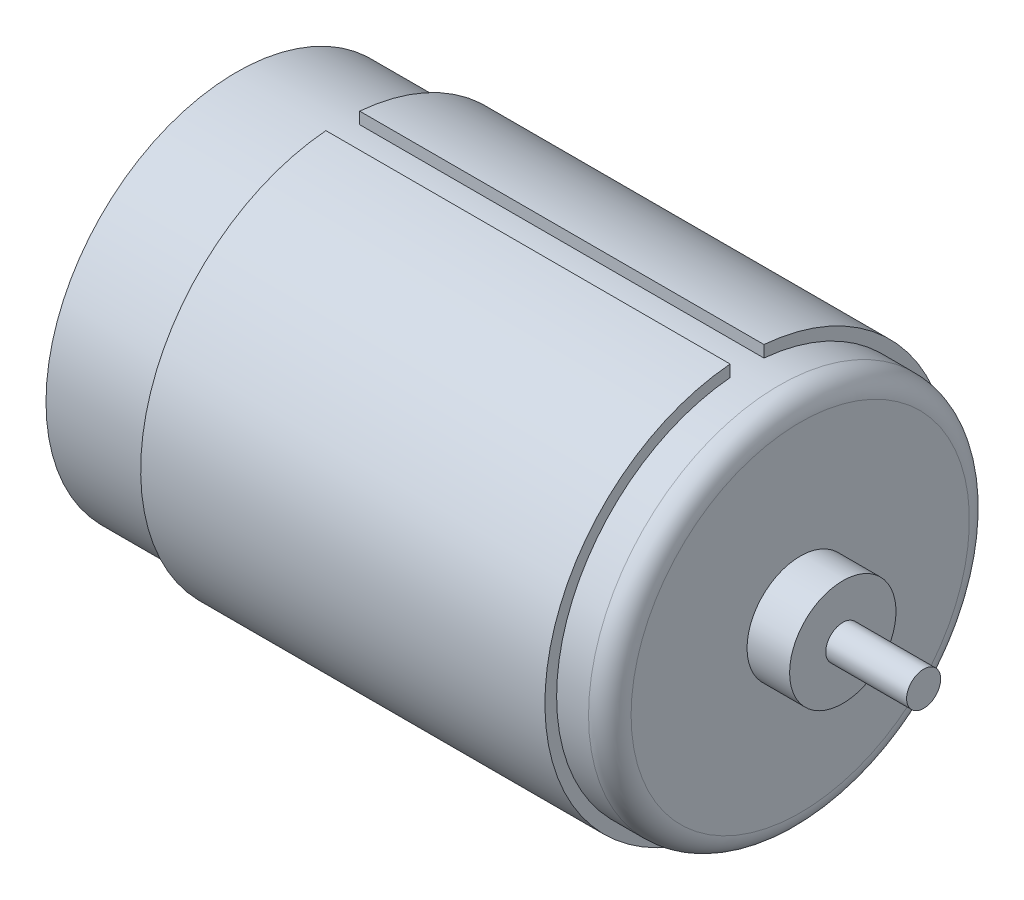
ISO-10303-21;
HEADER;
FILE_DESCRIPTION(('STEP AP214'),'2;1');
FILE_NAME('part.step','',(''),(''),'','','');
FILE_SCHEMA(('AUTOMOTIVE_DESIGN { 1 0 10303 214 1 1 1 1 }'));
ENDSEC;
DATA;
#1=APPLICATION_CONTEXT('core data for automotive mechanical design processes');
#2=APPLICATION_PROTOCOL_DEFINITION('international standard','automotive_design',2000,#1);
#3=PRODUCT_CONTEXT('',#1,'mechanical');
#4=PRODUCT('Part','Part','',(#3));
#5=PRODUCT_RELATED_PRODUCT_CATEGORY('part','',(#4));
#6=PRODUCT_DEFINITION_FORMATION('','',#4);
#7=PRODUCT_DEFINITION_CONTEXT('part definition',#1,'design');
#8=PRODUCT_DEFINITION('design','',#6,#7);
#9=PRODUCT_DEFINITION_SHAPE('','',#8);
#10=(LENGTH_UNIT() NAMED_UNIT(*) SI_UNIT(.MILLI.,.METRE.));
#11=(NAMED_UNIT(*) PLANE_ANGLE_UNIT() SI_UNIT($,.RADIAN.));
#12=(NAMED_UNIT(*) SI_UNIT($,.STERADIAN.) SOLID_ANGLE_UNIT());
#13=UNCERTAINTY_MEASURE_WITH_UNIT(LENGTH_MEASURE(1.E-05),#10,'distance_accuracy_value','');
#14=(GEOMETRIC_REPRESENTATION_CONTEXT(3) GLOBAL_UNCERTAINTY_ASSIGNED_CONTEXT((#13)) GLOBAL_UNIT_ASSIGNED_CONTEXT((#10,
#11,#12)) REPRESENTATION_CONTEXT('',''));
#15=CARTESIAN_POINT('',(0.,0.,0.));
#16=DIRECTION('',(0.,0.,1.));
#17=DIRECTION('',(1.,0.,0.));
#18=AXIS2_PLACEMENT_3D('',#15,#16,#17);
#19=CARTESIAN_POINT('',(0.,0.,0.));
#20=DIRECTION('',(1.,0.,0.));
#21=DIRECTION('',(0.,0.,-1.));
#22=AXIS2_PLACEMENT_3D('',#19,#20,#21);
#23=PLANE('',#22);
#24=CARTESIAN_POINT('',(0.,0.,0.));
#25=DIRECTION('',(-1.,0.,0.));
#26=DIRECTION('',(0.,0.,1.));
#27=AXIS2_PLACEMENT_3D('',#24,#25,#26);
#28=CIRCLE('',#27,17.9);
#29=CARTESIAN_POINT('',(0.,0.,17.9));
#30=VERTEX_POINT('',#29);
#31=EDGE_CURVE('E11',#30,#30,#28,.T.);
#32=ORIENTED_EDGE('',*,*,#31,.T.);
#33=EDGE_LOOP('',(#32));
#34=FACE_BOUND('',#33,.T.);
#35=ADVANCED_FACE('F33',(#34),#23,.F.);
#36=CARTESIAN_POINT('',(10.,17.9,0.));
#37=DIRECTION('',(1.,0.,0.));
#38=DIRECTION('',(0.,0.,-1.));
#39=AXIS2_PLACEMENT_3D('',#36,#37,#38);
#40=PLANE('',#39);
#41=CARTESIAN_POINT('',(10.,0.,0.));
#42=DIRECTION('',(-1.,0.,0.));
#43=DIRECTION('',(0.,0.,1.));
#44=AXIS2_PLACEMENT_3D('',#41,#42,#43);
#45=CIRCLE('',#44,17.9);
#46=CARTESIAN_POINT('',(10.,17.829465604723,-1.5875));
#47=VERTEX_POINT('',#46);
#48=CARTESIAN_POINT('',(10.,17.829465604723,1.5875));
#49=VERTEX_POINT('',#48);
#50=EDGE_CURVE('E41',#47,#49,#45,.T.);
#51=ORIENTED_EDGE('',*,*,#50,.F.);
#52=DIRECTION('',(0.,-1.,0.));
#53=VECTOR('',#52,1.);
#54=CARTESIAN_POINT('',(10.,18.9335639473925,-1.5875));
#55=LINE('',#54,#53);
#56=CARTESIAN_POINT('',(10.,18.9335639473925,-1.5875));
#57=VERTEX_POINT('',#56);
#58=EDGE_CURVE('E81',#57,#47,#55,.T.);
#59=ORIENTED_EDGE('',*,*,#58,.F.);
#60=CARTESIAN_POINT('',(10.,0.,0.));
#61=DIRECTION('',(-1.,0.,0.));
#62=DIRECTION('',(0.,0.,1.));
#63=AXIS2_PLACEMENT_3D('',#60,#61,#62);
#64=CIRCLE('',#63,19.);
#65=CARTESIAN_POINT('',(10.,18.9335639473925,1.5875));
#66=VERTEX_POINT('',#65);
#67=EDGE_CURVE('E89',#57,#66,#64,.T.);
#68=ORIENTED_EDGE('',*,*,#67,.T.);
#69=DIRECTION('',(0.,1.,0.));
#70=VECTOR('',#69,1.);
#71=CARTESIAN_POINT('',(10.,18.9335639473925,1.5875));
#72=LINE('',#71,#70);
#73=EDGE_CURVE('E74',#49,#66,#72,.T.);
#74=ORIENTED_EDGE('',*,*,#73,.F.);
#75=EDGE_LOOP('',(#51,#59,#68,#74));
#76=FACE_BOUND('',#75,.T.);
#77=ADVANCED_FACE('F86',(#76),#40,.F.);
#78=CARTESIAN_POINT('',(0.,0.,0.));
#79=DIRECTION('',(-1.,0.,0.));
#80=DIRECTION('',(0.,0.,1.));
#81=AXIS2_PLACEMENT_3D('',#78,#79,#80);
#82=CYLINDRICAL_SURFACE('',#81,19.);
#83=ORIENTED_EDGE('',*,*,#67,.F.);
#84=DIRECTION('',(-1.,0.,0.));
#85=VECTOR('',#84,1.);
#86=CARTESIAN_POINT('',(64.601,18.9335639473925,-1.5875));
#87=LINE('',#86,#85);
#88=CARTESIAN_POINT('',(48.,18.9335639473925,-1.5875));
#89=VERTEX_POINT('',#88);
#90=EDGE_CURVE('E127',#89,#57,#87,.T.);
#91=ORIENTED_EDGE('',*,*,#90,.F.);
#92=CARTESIAN_POINT('',(48.,0.,0.));
#93=DIRECTION('',(-1.,0.,0.));
#94=DIRECTION('',(0.,0.,1.));
#95=AXIS2_PLACEMENT_3D('',#92,#93,#94);
#96=CIRCLE('',#95,19.);
#97=CARTESIAN_POINT('',(48.,18.9335639473925,1.5875));
#98=VERTEX_POINT('',#97);
#99=EDGE_CURVE('E94',#89,#98,#96,.T.);
#100=ORIENTED_EDGE('',*,*,#99,.T.);
#101=DIRECTION('',(-1.,0.,0.));
#102=VECTOR('',#101,1.);
#103=CARTESIAN_POINT('',(64.601,18.9335639473925,1.5875));
#104=LINE('',#103,#102);
#105=EDGE_CURVE('E80',#98,#66,#104,.T.);
#106=ORIENTED_EDGE('',*,*,#105,.T.);
#107=EDGE_LOOP('',(#83,#91,#100,#106));
#108=FACE_BOUND('',#107,.T.);
#109=ADVANCED_FACE('F136',(#108),#82,.T.);
#110=CARTESIAN_POINT('',(48.,19.,0.));
#111=DIRECTION('',(-1.,0.,0.));
#112=DIRECTION('',(0.,0.,1.));
#113=AXIS2_PLACEMENT_3D('',#110,#111,#112);
#114=PLANE('',#113);
#115=ORIENTED_EDGE('',*,*,#99,.F.);
#116=DIRECTION('',(0.,1.,0.));
#117=VECTOR('',#116,1.);
#118=CARTESIAN_POINT('',(48.,18.9335639473925,-1.5875));
#119=LINE('',#118,#117);
#120=CARTESIAN_POINT('',(48.,17.829465604723,-1.5875));
#121=VERTEX_POINT('',#120);
#122=EDGE_CURVE('E90',#121,#89,#119,.T.);
#123=ORIENTED_EDGE('',*,*,#122,.F.);
#124=CARTESIAN_POINT('',(48.,0.,0.));
#125=DIRECTION('',(-1.,0.,0.));
#126=DIRECTION('',(0.,0.,1.));
#127=AXIS2_PLACEMENT_3D('',#124,#125,#126);
#128=CIRCLE('',#127,17.9);
#129=CARTESIAN_POINT('',(48.,17.829465604723,1.5875));
#130=VERTEX_POINT('',#129);
#131=EDGE_CURVE('E99',#121,#130,#128,.T.);
#132=ORIENTED_EDGE('',*,*,#131,.T.);
#133=DIRECTION('',(0.,-1.,0.));
#134=VECTOR('',#133,1.);
#135=CARTESIAN_POINT('',(48.,18.9335639473925,1.5875));
#136=LINE('',#135,#134);
#137=EDGE_CURVE('E48',#98,#130,#136,.T.);
#138=ORIENTED_EDGE('',*,*,#137,.F.);
#139=EDGE_LOOP('',(#115,#123,#132,#138));
#140=FACE_BOUND('',#139,.T.);
#141=ADVANCED_FACE('F137',(#140),#114,.F.);
#142=CARTESIAN_POINT('',(0.,0.,0.));
#143=DIRECTION('',(-1.,0.,0.));
#144=DIRECTION('',(0.,0.,1.));
#145=AXIS2_PLACEMENT_3D('',#142,#143,#144);
#146=CYLINDRICAL_SURFACE('',#145,17.9);
#147=ORIENTED_EDGE('',*,*,#131,.F.);
#148=DIRECTION('',(-1.,0.,0.));
#149=VECTOR('',#148,1.);
#150=CARTESIAN_POINT('',(64.601,17.829465604723,-1.5875));
#151=LINE('',#150,#149);
#152=EDGE_CURVE('E56',#121,#47,#151,.T.);
#153=ORIENTED_EDGE('',*,*,#152,.T.);
#154=ORIENTED_EDGE('',*,*,#50,.T.);
#155=DIRECTION('',(-1.,0.,0.));
#156=VECTOR('',#155,1.);
#157=CARTESIAN_POINT('',(64.601,17.829465604723,1.5875));
#158=LINE('',#157,#156);
#159=EDGE_CURVE('E71',#130,#49,#158,.T.);
#160=ORIENTED_EDGE('',*,*,#159,.F.);
#161=EDGE_LOOP('',(#147,#153,#154,#160));
#162=FACE_BOUND('',#161,.T.);
#163=CARTESIAN_POINT('',(51.,0.,0.));
#164=DIRECTION('',(-1.,0.,0.));
#165=DIRECTION('',(0.,0.,1.));
#166=AXIS2_PLACEMENT_3D('',#163,#164,#165);
#167=CIRCLE('',#166,17.9);
#168=CARTESIAN_POINT('',(51.,0.,17.9));
#169=VERTEX_POINT('',#168);
#170=EDGE_CURVE('E101',#169,#169,#167,.T.);
#171=ORIENTED_EDGE('',*,*,#170,.T.);
#172=EDGE_LOOP('',(#171));
#173=FACE_BOUND('',#172,.T.);
#174=ORIENTED_EDGE('',*,*,#31,.F.);
#175=EDGE_LOOP('',(#174));
#176=FACE_BOUND('',#175,.T.);
#177=ADVANCED_FACE('F92',(#162,#173,#176),#146,.T.);
#178=CARTESIAN_POINT('',(51.,0.,0.));
#179=DIRECTION('',(-1.,0.,0.));
#180=DIRECTION('',(0.,0.,1.));
#181=AXIS2_PLACEMENT_3D('',#178,#179,#180);
#182=TOROIDAL_SURFACE('',#181,15.9,2.);
#183=ORIENTED_EDGE('',*,*,#170,.F.);
#184=EDGE_LOOP('',(#183));
#185=FACE_BOUND('',#184,.T.);
#186=CARTESIAN_POINT('',(53.,0.,0.));
#187=DIRECTION('',(-1.,0.,0.));
#188=DIRECTION('',(0.,0.,1.));
#189=AXIS2_PLACEMENT_3D('',#186,#187,#188);
#190=CIRCLE('',#189,15.9);
#191=CARTESIAN_POINT('',(53.,0.,15.9));
#192=VERTEX_POINT('',#191);
#193=EDGE_CURVE('E104',#192,#192,#190,.T.);
#194=ORIENTED_EDGE('',*,*,#193,.T.);
#195=EDGE_LOOP('',(#194));
#196=FACE_BOUND('',#195,.T.);
#197=ADVANCED_FACE('F144',(#185,#196),#182,.T.);
#198=CARTESIAN_POINT('',(53.,15.9,0.));
#199=DIRECTION('',(-1.,0.,0.));
#200=DIRECTION('',(0.,0.,1.));
#201=AXIS2_PLACEMENT_3D('',#198,#199,#200);
#202=PLANE('',#201);
#203=ORIENTED_EDGE('',*,*,#193,.F.);
#204=EDGE_LOOP('',(#203));
#205=FACE_BOUND('',#204,.T.);
#206=CARTESIAN_POINT('',(53.,0.,0.));
#207=DIRECTION('',(-1.,0.,0.));
#208=DIRECTION('',(0.,0.,1.));
#209=AXIS2_PLACEMENT_3D('',#206,#207,#208);
#210=CIRCLE('',#209,5.);
#211=CARTESIAN_POINT('',(53.,0.,5.));
#212=VERTEX_POINT('',#211);
#213=EDGE_CURVE('E107',#212,#212,#210,.T.);
#214=ORIENTED_EDGE('',*,*,#213,.T.);
#215=EDGE_LOOP('',(#214));
#216=FACE_BOUND('',#215,.T.);
#217=ADVANCED_FACE('F234',(#205,#216),#202,.F.);
#218=CARTESIAN_POINT('',(0.,0.,0.));
#219=DIRECTION('',(-1.,0.,0.));
#220=DIRECTION('',(0.,0.,1.));
#221=AXIS2_PLACEMENT_3D('',#218,#219,#220);
#222=CYLINDRICAL_SURFACE('',#221,5.);
#223=ORIENTED_EDGE('',*,*,#213,.F.);
#224=EDGE_LOOP('',(#223));
#225=FACE_BOUND('',#224,.T.);
#226=CARTESIAN_POINT('',(57.,0.,0.));
#227=DIRECTION('',(-1.,0.,0.));
#228=DIRECTION('',(0.,0.,1.));
#229=AXIS2_PLACEMENT_3D('',#226,#227,#228);
#230=CIRCLE('',#229,5.);
#231=CARTESIAN_POINT('',(57.,0.,5.));
#232=VERTEX_POINT('',#231);
#233=EDGE_CURVE('E110',#232,#232,#230,.T.);
#234=ORIENTED_EDGE('',*,*,#233,.T.);
#235=EDGE_LOOP('',(#234));
#236=FACE_BOUND('',#235,.T.);
#237=ADVANCED_FACE('F243',(#225,#236),#222,.T.);
#238=CARTESIAN_POINT('',(57.,5.,0.));
#239=DIRECTION('',(-1.,0.,0.));
#240=DIRECTION('',(0.,0.,1.));
#241=AXIS2_PLACEMENT_3D('',#238,#239,#240);
#242=PLANE('',#241);
#243=ORIENTED_EDGE('',*,*,#233,.F.);
#244=EDGE_LOOP('',(#243));
#245=FACE_BOUND('',#244,.T.);
#246=CARTESIAN_POINT('',(57.,0.,0.));
#247=DIRECTION('',(-1.,0.,0.));
#248=DIRECTION('',(0.,0.,1.));
#249=AXIS2_PLACEMENT_3D('',#246,#247,#248);
#250=CIRCLE('',#249,1.6);
#251=CARTESIAN_POINT('',(57.,0.,1.6));
#252=VERTEX_POINT('',#251);
#253=EDGE_CURVE('E113',#252,#252,#250,.T.);
#254=ORIENTED_EDGE('',*,*,#253,.T.);
#255=EDGE_LOOP('',(#254));
#256=FACE_BOUND('',#255,.T.);
#257=ADVANCED_FACE('F252',(#245,#256),#242,.F.);
#258=CARTESIAN_POINT('',(0.,0.,0.));
#259=DIRECTION('',(-1.,0.,0.));
#260=DIRECTION('',(0.,0.,1.));
#261=AXIS2_PLACEMENT_3D('',#258,#259,#260);
#262=CYLINDRICAL_SURFACE('',#261,1.6);
#263=ORIENTED_EDGE('',*,*,#253,.F.);
#264=EDGE_LOOP('',(#263));
#265=FACE_BOUND('',#264,.T.);
#266=CARTESIAN_POINT('',(64.6,0.,0.));
#267=DIRECTION('',(-1.,0.,0.));
#268=DIRECTION('',(0.,0.,1.));
#269=AXIS2_PLACEMENT_3D('',#266,#267,#268);
#270=CIRCLE('',#269,1.6);
#271=CARTESIAN_POINT('',(64.6,0.,1.6));
#272=VERTEX_POINT('',#271);
#273=EDGE_CURVE('E116',#272,#272,#270,.T.);
#274=ORIENTED_EDGE('',*,*,#273,.T.);
#275=EDGE_LOOP('',(#274));
#276=FACE_BOUND('',#275,.T.);
#277=ADVANCED_FACE('F261',(#265,#276),#262,.T.);
#278=CARTESIAN_POINT('',(64.6,1.6,0.));
#279=DIRECTION('',(-1.,0.,0.));
#280=DIRECTION('',(0.,0.,1.));
#281=AXIS2_PLACEMENT_3D('',#278,#279,#280);
#282=PLANE('',#281);
#283=ORIENTED_EDGE('',*,*,#273,.F.);
#284=EDGE_LOOP('',(#283));
#285=FACE_BOUND('',#284,.T.);
#286=ADVANCED_FACE('F183',(#285),#282,.F.);
#287=CARTESIAN_POINT('',(64.601,18.9335639473925,-1.5875));
#288=DIRECTION('',(0.,0.,-1.));
#289=DIRECTION('',(0.,1.,0.));
#290=AXIS2_PLACEMENT_3D('',#287,#288,#289);
#291=PLANE('',#290);
#292=ORIENTED_EDGE('',*,*,#122,.T.);
#293=ORIENTED_EDGE('',*,*,#90,.T.);
#294=ORIENTED_EDGE('',*,*,#58,.T.);
#295=ORIENTED_EDGE('',*,*,#152,.F.);
#296=EDGE_LOOP('',(#292,#293,#294,#295));
#297=FACE_BOUND('',#296,.T.);
#298=ADVANCED_FACE('F132',(#297),#291,.F.);
#299=CARTESIAN_POINT('',(64.601,18.9335639473925,1.5875));
#300=DIRECTION('',(0.,0.,1.));
#301=DIRECTION('',(0.,-1.,0.));
#302=AXIS2_PLACEMENT_3D('',#299,#300,#301);
#303=PLANE('',#302);
#304=ORIENTED_EDGE('',*,*,#137,.T.);
#305=ORIENTED_EDGE('',*,*,#159,.T.);
#306=ORIENTED_EDGE('',*,*,#73,.T.);
#307=ORIENTED_EDGE('',*,*,#105,.F.);
#308=EDGE_LOOP('',(#304,#305,#306,#307));
#309=FACE_BOUND('',#308,.T.);
#310=ADVANCED_FACE('F73',(#309),#303,.F.);
#311=CLOSED_SHELL('',(#35,#77,#109,#141,#177,#197,#217,#237,#257,#277,#286,#298,#310));
#312=CARTESIAN_POINT('',(49.6754757200503,14.1005717517913,0.));
#313=DIRECTION('',(1.,0.,0.));
#314=DIRECTION('',(0.,0.,-1.));
#315=AXIS2_PLACEMENT_3D('',#312,#313,#314);
#316=PLANE('',#315);
#317=CARTESIAN_POINT('',(49.6754757200503,0.,0.));
#318=DIRECTION('',(-1.,0.,0.));
#319=DIRECTION('',(0.,0.,1.));
#320=AXIS2_PLACEMENT_3D('',#317,#318,#319);
#321=CIRCLE('',#320,14.1005717517913);
#322=CARTESIAN_POINT('',(49.6754757200503,0.,14.1005717517913));
#323=VERTEX_POINT('',#322);
#324=EDGE_CURVE('E119',#323,#323,#321,.T.);
#325=ORIENTED_EDGE('',*,*,#324,.T.);
#326=EDGE_LOOP('',(#325));
#327=FACE_BOUND('',#326,.T.);
#328=ADVANCED_FACE('F197',(#327),#316,.F.);
#329=CARTESIAN_POINT('',(0.,0.,0.));
#330=DIRECTION('',(-1.,0.,0.));
#331=DIRECTION('',(0.,0.,1.));
#332=AXIS2_PLACEMENT_3D('',#329,#330,#331);
#333=CYLINDRICAL_SURFACE('',#332,14.1005717517913);
#334=ORIENTED_EDGE('',*,*,#324,.F.);
#335=EDGE_LOOP('',(#334));
#336=FACE_BOUND('',#335,.T.);
#337=CARTESIAN_POINT('',(3.51196853303332,0.,0.));
#338=DIRECTION('',(-1.,0.,0.));
#339=DIRECTION('',(0.,0.,1.));
#340=AXIS2_PLACEMENT_3D('',#337,#338,#339);
#341=CIRCLE('',#340,14.1005717517913);
#342=CARTESIAN_POINT('',(3.51196853303332,0.,14.1005717517913));
#343=VERTEX_POINT('',#342);
#344=EDGE_CURVE('E122',#343,#343,#341,.T.);
#345=ORIENTED_EDGE('',*,*,#344,.T.);
#346=EDGE_LOOP('',(#345));
#347=FACE_BOUND('',#346,.T.);
#348=ADVANCED_FACE('F201',(#336,#347),#333,.F.);
#349=CARTESIAN_POINT('',(3.51196853303332,14.1005717517913,0.));
#350=DIRECTION('',(-1.,0.,0.));
#351=DIRECTION('',(0.,0.,1.));
#352=AXIS2_PLACEMENT_3D('',#349,#350,#351);
#353=PLANE('',#352);
#354=ORIENTED_EDGE('',*,*,#344,.F.);
#355=EDGE_LOOP('',(#354));
#356=FACE_BOUND('',#355,.T.);
#357=ADVANCED_FACE('F211',(#356),#353,.F.);
#358=CLOSED_SHELL('',(#328,#348,#357));
#359=ORIENTED_CLOSED_SHELL('',*,#358,.T.);
#360=BREP_WITH_VOIDS('B2',#311,(#359));
#361=ADVANCED_BREP_SHAPE_REPRESENTATION('',(#18,#360),#14);
#362=SHAPE_DEFINITION_REPRESENTATION(#9,#361);
ENDSEC;
END-ISO-10303-21;
